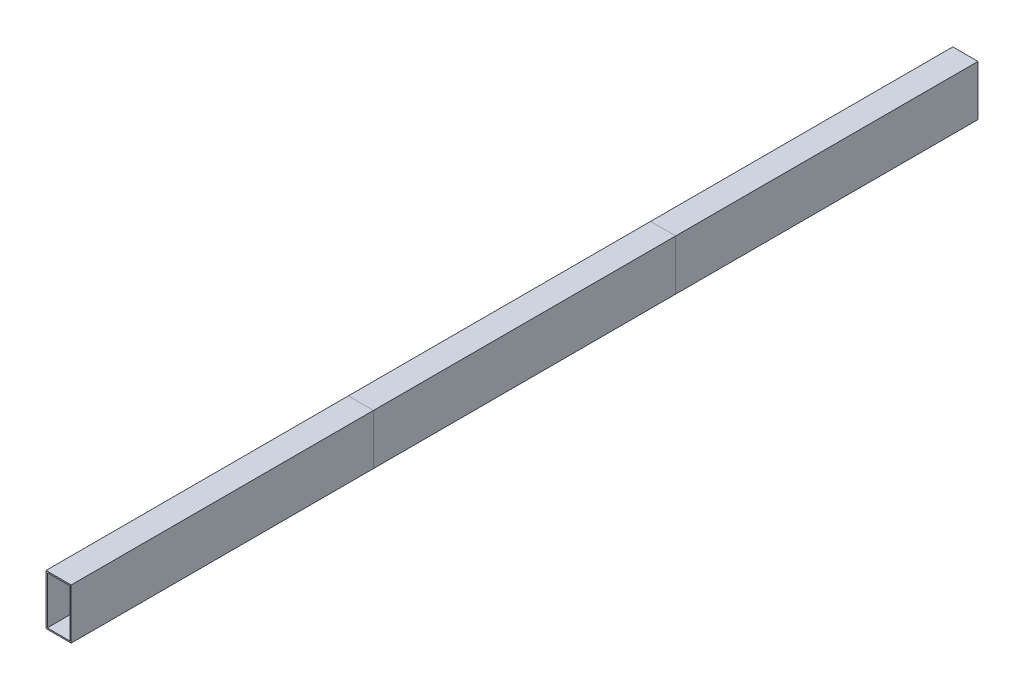
ISO-10303-21;
HEADER;
FILE_DESCRIPTION(('STEP AP214'),'2;1');
FILE_NAME('part.step','',(''),(''),'','','');
FILE_SCHEMA(('AUTOMOTIVE_DESIGN { 1 0 10303 214 1 1 1 1 }'));
ENDSEC;
DATA;
#1=APPLICATION_CONTEXT('core data for automotive mechanical design processes');
#2=APPLICATION_PROTOCOL_DEFINITION('international standard','automotive_design',2000,#1);
#3=PRODUCT_CONTEXT('',#1,'mechanical');
#4=PRODUCT('Part','Part','',(#3));
#5=PRODUCT_RELATED_PRODUCT_CATEGORY('part','',(#4));
#6=PRODUCT_DEFINITION_FORMATION('','',#4);
#7=PRODUCT_DEFINITION_CONTEXT('part definition',#1,'design');
#8=PRODUCT_DEFINITION('design','',#6,#7);
#9=PRODUCT_DEFINITION_SHAPE('','',#8);
#10=(LENGTH_UNIT() NAMED_UNIT(*) SI_UNIT(.MILLI.,.METRE.));
#11=(NAMED_UNIT(*) PLANE_ANGLE_UNIT() SI_UNIT($,.RADIAN.));
#12=(NAMED_UNIT(*) SI_UNIT($,.STERADIAN.) SOLID_ANGLE_UNIT());
#13=UNCERTAINTY_MEASURE_WITH_UNIT(LENGTH_MEASURE(1.E-05),#10,'distance_accuracy_value','');
#14=(GEOMETRIC_REPRESENTATION_CONTEXT(3) GLOBAL_UNCERTAINTY_ASSIGNED_CONTEXT((#13)) GLOBAL_UNIT_ASSIGNED_CONTEXT((#10,
#11,#12)) REPRESENTATION_CONTEXT('',''));
#15=CARTESIAN_POINT('',(0.,0.,0.));
#16=DIRECTION('',(0.,0.,1.));
#17=DIRECTION('',(1.,0.,0.));
#18=AXIS2_PLACEMENT_3D('',#15,#16,#17);
#19=CARTESIAN_POINT('',(-50.,0.,3600.));
#20=DIRECTION('',(-1.,0.,0.));
#21=DIRECTION('',(0.,0.,1.));
#22=AXIS2_PLACEMENT_3D('',#19,#20,#21);
#23=PLANE('',#22);
#24=DIRECTION('',(0.,1.,0.));
#25=VECTOR('',#24,1.);
#26=CARTESIAN_POINT('',(-50.,0.,2400.));
#27=LINE('',#26,#25);
#28=CARTESIAN_POINT('',(-50.,-100.,2400.));
#29=VERTEX_POINT('',#28);
#30=CARTESIAN_POINT('',(-50.,100.,2400.));
#31=VERTEX_POINT('',#30);
#32=EDGE_CURVE('E148',#29,#31,#27,.T.);
#33=ORIENTED_EDGE('',*,*,#32,.F.);
#34=DIRECTION('',(0.,0.,-1.));
#35=VECTOR('',#34,1.);
#36=CARTESIAN_POINT('',(-50.,-100.,3600.));
#37=LINE('',#36,#35);
#38=CARTESIAN_POINT('',(-50.,-100.,3600.));
#39=VERTEX_POINT('',#38);
#40=EDGE_CURVE('E13',#39,#29,#37,.T.);
#41=ORIENTED_EDGE('',*,*,#40,.F.);
#42=DIRECTION('',(0.,1.,0.));
#43=VECTOR('',#42,1.);
#44=CARTESIAN_POINT('',(-50.,0.,3600.));
#45=LINE('',#44,#43);
#46=CARTESIAN_POINT('',(-50.,100.,3600.));
#47=VERTEX_POINT('',#46);
#48=EDGE_CURVE('E152',#39,#47,#45,.T.);
#49=ORIENTED_EDGE('',*,*,#48,.T.);
#50=DIRECTION('',(0.,0.,-1.));
#51=VECTOR('',#50,1.);
#52=CARTESIAN_POINT('',(-50.,100.,3600.));
#53=LINE('',#52,#51);
#54=EDGE_CURVE('E54',#47,#31,#53,.T.);
#55=ORIENTED_EDGE('',*,*,#54,.T.);
#56=EDGE_LOOP('',(#33,#41,#49,#55));
#57=FACE_BOUND('',#56,.T.);
#58=ADVANCED_FACE('F51',(#57),#23,.T.);
#59=CARTESIAN_POINT('',(0.,-100.,3600.));
#60=DIRECTION('',(0.,-1.,0.));
#61=DIRECTION('',(0.,0.,-1.));
#62=AXIS2_PLACEMENT_3D('',#59,#60,#61);
#63=PLANE('',#62);
#64=DIRECTION('',(-1.,0.,0.));
#65=VECTOR('',#64,1.);
#66=CARTESIAN_POINT('',(0.,-100.,2400.));
#67=LINE('',#66,#65);
#68=CARTESIAN_POINT('',(50.,-100.,2400.));
#69=VERTEX_POINT('',#68);
#70=EDGE_CURVE('E156',#69,#29,#67,.T.);
#71=ORIENTED_EDGE('',*,*,#70,.F.);
#72=DIRECTION('',(0.,0.,-1.));
#73=VECTOR('',#72,1.);
#74=CARTESIAN_POINT('',(50.,-100.,3600.));
#75=LINE('',#74,#73);
#76=CARTESIAN_POINT('',(50.,-100.,3600.));
#77=VERTEX_POINT('',#76);
#78=EDGE_CURVE('E59',#77,#69,#75,.T.);
#79=ORIENTED_EDGE('',*,*,#78,.F.);
#80=DIRECTION('',(-1.,0.,0.));
#81=VECTOR('',#80,1.);
#82=CARTESIAN_POINT('',(0.,-100.,3600.));
#83=LINE('',#82,#81);
#84=EDGE_CURVE('E162',#77,#39,#83,.T.);
#85=ORIENTED_EDGE('',*,*,#84,.T.);
#86=ORIENTED_EDGE('',*,*,#40,.T.);
#87=EDGE_LOOP('',(#71,#79,#85,#86));
#88=FACE_BOUND('',#87,.T.);
#89=ADVANCED_FACE('F189',(#88),#63,.T.);
#90=CARTESIAN_POINT('',(50.,0.,3600.));
#91=DIRECTION('',(1.,0.,0.));
#92=DIRECTION('',(0.,0.,-1.));
#93=AXIS2_PLACEMENT_3D('',#90,#91,#92);
#94=PLANE('',#93);
#95=DIRECTION('',(0.,-1.,0.));
#96=VECTOR('',#95,1.);
#97=CARTESIAN_POINT('',(50.,0.,2400.));
#98=LINE('',#97,#96);
#99=CARTESIAN_POINT('',(50.,100.,2400.));
#100=VERTEX_POINT('',#99);
#101=EDGE_CURVE('E170',#100,#69,#98,.T.);
#102=ORIENTED_EDGE('',*,*,#101,.F.);
#103=DIRECTION('',(0.,0.,-1.));
#104=VECTOR('',#103,1.);
#105=CARTESIAN_POINT('',(50.,100.,3600.));
#106=LINE('',#105,#104);
#107=CARTESIAN_POINT('',(50.,100.,3600.));
#108=VERTEX_POINT('',#107);
#109=EDGE_CURVE('E176',#108,#100,#106,.T.);
#110=ORIENTED_EDGE('',*,*,#109,.F.);
#111=DIRECTION('',(0.,-1.,0.));
#112=VECTOR('',#111,1.);
#113=CARTESIAN_POINT('',(50.,0.,3600.));
#114=LINE('',#113,#112);
#115=EDGE_CURVE('E159',#108,#77,#114,.T.);
#116=ORIENTED_EDGE('',*,*,#115,.T.);
#117=ORIENTED_EDGE('',*,*,#78,.T.);
#118=EDGE_LOOP('',(#102,#110,#116,#117));
#119=FACE_BOUND('',#118,.T.);
#120=ADVANCED_FACE('F193',(#119),#94,.T.);
#121=CARTESIAN_POINT('',(0.,100.,3600.));
#122=DIRECTION('',(0.,1.,0.));
#123=DIRECTION('',(0.,0.,1.));
#124=AXIS2_PLACEMENT_3D('',#121,#122,#123);
#125=PLANE('',#124);
#126=DIRECTION('',(1.,0.,0.));
#127=VECTOR('',#126,1.);
#128=CARTESIAN_POINT('',(0.,100.,2400.));
#129=LINE('',#128,#127);
#130=EDGE_CURVE('E167',#31,#100,#129,.T.);
#131=ORIENTED_EDGE('',*,*,#130,.F.);
#132=ORIENTED_EDGE('',*,*,#54,.F.);
#133=DIRECTION('',(1.,0.,0.));
#134=VECTOR('',#133,1.);
#135=CARTESIAN_POINT('',(0.,100.,3600.));
#136=LINE('',#135,#134);
#137=EDGE_CURVE('E155',#47,#108,#136,.T.);
#138=ORIENTED_EDGE('',*,*,#137,.T.);
#139=ORIENTED_EDGE('',*,*,#109,.T.);
#140=EDGE_LOOP('',(#131,#132,#138,#139));
#141=FACE_BOUND('',#140,.T.);
#142=ADVANCED_FACE('F184',(#141),#125,.T.);
#143=CARTESIAN_POINT('',(0.,0.,3600.));
#144=DIRECTION('',(0.,0.,-1.));
#145=DIRECTION('',(-1.,0.,0.));
#146=AXIS2_PLACEMENT_3D('',#143,#144,#145);
#147=PLANE('',#146);
#148=DIRECTION('',(-1.,0.,0.));
#149=VECTOR('',#148,1.);
#150=CARTESIAN_POINT('',(0.,-95.,3600.));
#151=LINE('',#150,#149);
#152=CARTESIAN_POINT('',(45.,-95.,3600.));
#153=VERTEX_POINT('',#152);
#154=CARTESIAN_POINT('',(-45.,-95.,3600.));
#155=VERTEX_POINT('',#154);
#156=EDGE_CURVE('E123',#153,#155,#151,.T.);
#157=ORIENTED_EDGE('',*,*,#156,.T.);
#158=DIRECTION('',(0.,1.,0.));
#159=VECTOR('',#158,1.);
#160=CARTESIAN_POINT('',(-45.,0.,3600.));
#161=LINE('',#160,#159);
#162=CARTESIAN_POINT('',(-45.,95.,3600.));
#163=VERTEX_POINT('',#162);
#164=EDGE_CURVE('E117',#155,#163,#161,.T.);
#165=ORIENTED_EDGE('',*,*,#164,.T.);
#166=DIRECTION('',(1.,0.,0.));
#167=VECTOR('',#166,1.);
#168=CARTESIAN_POINT('',(0.,95.,3600.));
#169=LINE('',#168,#167);
#170=CARTESIAN_POINT('',(45.,95.,3600.));
#171=VERTEX_POINT('',#170);
#172=EDGE_CURVE('E126',#163,#171,#169,.T.);
#173=ORIENTED_EDGE('',*,*,#172,.T.);
#174=DIRECTION('',(0.,-1.,0.));
#175=VECTOR('',#174,1.);
#176=CARTESIAN_POINT('',(45.,0.,3600.));
#177=LINE('',#176,#175);
#178=EDGE_CURVE('E66',#171,#153,#177,.T.);
#179=ORIENTED_EDGE('',*,*,#178,.T.);
#180=EDGE_LOOP('',(#157,#165,#173,#179));
#181=FACE_BOUND('',#180,.T.);
#182=ORIENTED_EDGE('',*,*,#48,.F.);
#183=ORIENTED_EDGE('',*,*,#84,.F.);
#184=ORIENTED_EDGE('',*,*,#115,.F.);
#185=ORIENTED_EDGE('',*,*,#137,.F.);
#186=EDGE_LOOP('',(#182,#183,#184,#185));
#187=FACE_BOUND('',#186,.T.);
#188=ADVANCED_FACE('F130',(#181,#187),#147,.F.);
#189=CARTESIAN_POINT('',(0.,0.,2400.));
#190=DIRECTION('',(0.,0.,-1.));
#191=DIRECTION('',(-1.,0.,0.));
#192=AXIS2_PLACEMENT_3D('',#189,#190,#191);
#193=PLANE('',#192);
#194=DIRECTION('',(0.,1.,0.));
#195=VECTOR('',#194,1.);
#196=CARTESIAN_POINT('',(-45.,0.,2400.));
#197=LINE('',#196,#195);
#198=CARTESIAN_POINT('',(-45.,-95.,2400.));
#199=VERTEX_POINT('',#198);
#200=CARTESIAN_POINT('',(-45.,95.,2400.));
#201=VERTEX_POINT('',#200);
#202=EDGE_CURVE('E74',#199,#201,#197,.T.);
#203=ORIENTED_EDGE('',*,*,#202,.F.);
#204=DIRECTION('',(-1.,0.,0.));
#205=VECTOR('',#204,1.);
#206=CARTESIAN_POINT('',(0.,-95.,2400.));
#207=LINE('',#206,#205);
#208=CARTESIAN_POINT('',(45.,-95.,2400.));
#209=VERTEX_POINT('',#208);
#210=EDGE_CURVE('E133',#209,#199,#207,.T.);
#211=ORIENTED_EDGE('',*,*,#210,.F.);
#212=DIRECTION('',(0.,-1.,0.));
#213=VECTOR('',#212,1.);
#214=CARTESIAN_POINT('',(45.,0.,2400.));
#215=LINE('',#214,#213);
#216=CARTESIAN_POINT('',(45.,95.,2400.));
#217=VERTEX_POINT('',#216);
#218=EDGE_CURVE('E136',#217,#209,#215,.T.);
#219=ORIENTED_EDGE('',*,*,#218,.F.);
#220=DIRECTION('',(1.,0.,0.));
#221=VECTOR('',#220,1.);
#222=CARTESIAN_POINT('',(0.,95.,2400.));
#223=LINE('',#222,#221);
#224=EDGE_CURVE('E142',#201,#217,#223,.T.);
#225=ORIENTED_EDGE('',*,*,#224,.F.);
#226=EDGE_LOOP('',(#203,#211,#219,#225));
#227=FACE_BOUND('',#226,.T.);
#228=ORIENTED_EDGE('',*,*,#32,.T.);
#229=ORIENTED_EDGE('',*,*,#130,.T.);
#230=ORIENTED_EDGE('',*,*,#101,.T.);
#231=ORIENTED_EDGE('',*,*,#70,.T.);
#232=EDGE_LOOP('',(#228,#229,#230,#231));
#233=FACE_BOUND('',#232,.T.);
#234=ADVANCED_FACE('F186',(#227,#233),#193,.T.);
#235=CARTESIAN_POINT('',(-45.,0.,3600.));
#236=DIRECTION('',(-1.,0.,0.));
#237=DIRECTION('',(0.,0.,1.));
#238=AXIS2_PLACEMENT_3D('',#235,#236,#237);
#239=PLANE('',#238);
#240=ORIENTED_EDGE('',*,*,#202,.T.);
#241=DIRECTION('',(0.,0.,-1.));
#242=VECTOR('',#241,1.);
#243=CARTESIAN_POINT('',(-45.,95.,3600.));
#244=LINE('',#243,#242);
#245=EDGE_CURVE('E113',#163,#201,#244,.T.);
#246=ORIENTED_EDGE('',*,*,#245,.F.);
#247=ORIENTED_EDGE('',*,*,#164,.F.);
#248=DIRECTION('',(0.,0.,-1.));
#249=VECTOR('',#248,1.);
#250=CARTESIAN_POINT('',(-45.,-95.,3600.));
#251=LINE('',#250,#249);
#252=EDGE_CURVE('E146',#155,#199,#251,.T.);
#253=ORIENTED_EDGE('',*,*,#252,.T.);
#254=EDGE_LOOP('',(#240,#246,#247,#253));
#255=FACE_BOUND('',#254,.T.);
#256=ADVANCED_FACE('F115',(#255),#239,.F.);
#257=CARTESIAN_POINT('',(0.,-95.,3600.));
#258=DIRECTION('',(0.,-1.,0.));
#259=DIRECTION('',(0.,0.,-1.));
#260=AXIS2_PLACEMENT_3D('',#257,#258,#259);
#261=PLANE('',#260);
#262=ORIENTED_EDGE('',*,*,#210,.T.);
#263=ORIENTED_EDGE('',*,*,#252,.F.);
#264=ORIENTED_EDGE('',*,*,#156,.F.);
#265=DIRECTION('',(0.,0.,-1.));
#266=VECTOR('',#265,1.);
#267=CARTESIAN_POINT('',(45.,-95.,3600.));
#268=LINE('',#267,#266);
#269=EDGE_CURVE('E149',#153,#209,#268,.T.);
#270=ORIENTED_EDGE('',*,*,#269,.T.);
#271=EDGE_LOOP('',(#262,#263,#264,#270));
#272=FACE_BOUND('',#271,.T.);
#273=ADVANCED_FACE('F244',(#272),#261,.F.);
#274=CARTESIAN_POINT('',(45.,0.,3600.));
#275=DIRECTION('',(1.,0.,0.));
#276=DIRECTION('',(0.,0.,-1.));
#277=AXIS2_PLACEMENT_3D('',#274,#275,#276);
#278=PLANE('',#277);
#279=ORIENTED_EDGE('',*,*,#218,.T.);
#280=ORIENTED_EDGE('',*,*,#269,.F.);
#281=ORIENTED_EDGE('',*,*,#178,.F.);
#282=DIRECTION('',(0.,0.,-1.));
#283=VECTOR('',#282,1.);
#284=CARTESIAN_POINT('',(45.,95.,3600.));
#285=LINE('',#284,#283);
#286=EDGE_CURVE('E122',#171,#217,#285,.T.);
#287=ORIENTED_EDGE('',*,*,#286,.T.);
#288=EDGE_LOOP('',(#279,#280,#281,#287));
#289=FACE_BOUND('',#288,.T.);
#290=ADVANCED_FACE('F253',(#289),#278,.F.);
#291=CARTESIAN_POINT('',(0.,95.,3600.));
#292=DIRECTION('',(0.,1.,0.));
#293=DIRECTION('',(0.,0.,1.));
#294=AXIS2_PLACEMENT_3D('',#291,#292,#293);
#295=PLANE('',#294);
#296=ORIENTED_EDGE('',*,*,#224,.T.);
#297=ORIENTED_EDGE('',*,*,#286,.F.);
#298=ORIENTED_EDGE('',*,*,#172,.F.);
#299=ORIENTED_EDGE('',*,*,#245,.T.);
#300=EDGE_LOOP('',(#296,#297,#298,#299));
#301=FACE_BOUND('',#300,.T.);
#302=ADVANCED_FACE('F127',(#301),#295,.F.);
#303=CLOSED_SHELL('',(#58,#89,#120,#142,#188,#234,#256,#273,#290,#302));
#304=MANIFOLD_SOLID_BREP('B2',#303);
#305=CARTESIAN_POINT('',(0.,0.,2400.));
#306=DIRECTION('',(0.,0.,1.));
#307=DIRECTION('',(1.,0.,0.));
#308=AXIS2_PLACEMENT_3D('',#305,#306,#307);
#309=PLANE('',#308);
#310=DIRECTION('',(0.,1.,0.));
#311=VECTOR('',#310,1.);
#312=CARTESIAN_POINT('',(50.,0.,2400.));
#313=LINE('',#312,#311);
#314=CARTESIAN_POINT('',(50.,-100.,2400.));
#315=VERTEX_POINT('',#314);
#316=CARTESIAN_POINT('',(50.,100.,2400.));
#317=VERTEX_POINT('',#316);
#318=EDGE_CURVE('E390',#315,#317,#313,.T.);
#319=ORIENTED_EDGE('',*,*,#318,.T.);
#320=DIRECTION('',(-1.,0.,0.));
#321=VECTOR('',#320,1.);
#322=CARTESIAN_POINT('',(0.,100.,2400.));
#323=LINE('',#322,#321);
#324=CARTESIAN_POINT('',(-50.,100.,2400.));
#325=VERTEX_POINT('',#324);
#326=EDGE_CURVE('E393',#317,#325,#323,.T.);
#327=ORIENTED_EDGE('',*,*,#326,.T.);
#328=DIRECTION('',(0.,-1.,0.));
#329=VECTOR('',#328,1.);
#330=CARTESIAN_POINT('',(-50.,0.,2400.));
#331=LINE('',#330,#329);
#332=CARTESIAN_POINT('',(-50.,-100.,2400.));
#333=VERTEX_POINT('',#332);
#334=EDGE_CURVE('E396',#325,#333,#331,.T.);
#335=ORIENTED_EDGE('',*,*,#334,.T.);
#336=DIRECTION('',(1.,0.,0.));
#337=VECTOR('',#336,1.);
#338=CARTESIAN_POINT('',(0.,-100.,2400.));
#339=LINE('',#338,#337);
#340=EDGE_CURVE('E398',#333,#315,#339,.T.);
#341=ORIENTED_EDGE('',*,*,#340,.T.);
#342=EDGE_LOOP('',(#319,#327,#335,#341));
#343=FACE_BOUND('',#342,.T.);
#344=DIRECTION('',(-1.,0.,0.));
#345=VECTOR('',#344,1.);
#346=CARTESIAN_POINT('',(0.,95.,2400.));
#347=LINE('',#346,#345);
#348=CARTESIAN_POINT('',(45.,95.,2400.));
#349=VERTEX_POINT('',#348);
#350=CARTESIAN_POINT('',(-45.,95.,2400.));
#351=VERTEX_POINT('',#350);
#352=EDGE_CURVE('E362',#349,#351,#347,.T.);
#353=ORIENTED_EDGE('',*,*,#352,.F.);
#354=DIRECTION('',(0.,1.,0.));
#355=VECTOR('',#354,1.);
#356=CARTESIAN_POINT('',(45.,0.,2400.));
#357=LINE('',#356,#355);
#358=CARTESIAN_POINT('',(45.,-95.,2400.));
#359=VERTEX_POINT('',#358);
#360=EDGE_CURVE('E354',#359,#349,#357,.T.);
#361=ORIENTED_EDGE('',*,*,#360,.F.);
#362=DIRECTION('',(1.,0.,0.));
#363=VECTOR('',#362,1.);
#364=CARTESIAN_POINT('',(0.,-95.,2400.));
#365=LINE('',#364,#363);
#366=CARTESIAN_POINT('',(-45.,-95.,2400.));
#367=VERTEX_POINT('',#366);
#368=EDGE_CURVE('E376',#367,#359,#365,.T.);
#369=ORIENTED_EDGE('',*,*,#368,.F.);
#370=DIRECTION('',(0.,-1.,0.));
#371=VECTOR('',#370,1.);
#372=CARTESIAN_POINT('',(-45.,0.,2400.));
#373=LINE('',#372,#371);
#374=EDGE_CURVE('E374',#351,#367,#373,.T.);
#375=ORIENTED_EDGE('',*,*,#374,.F.);
#376=EDGE_LOOP('',(#353,#361,#369,#375));
#377=FACE_BOUND('',#376,.T.);
#378=ADVANCED_FACE('F289',(#343,#377),#309,.T.);
#379=CARTESIAN_POINT('',(0.,0.,1200.));
#380=DIRECTION('',(0.,0.,1.));
#381=DIRECTION('',(1.,0.,0.));
#382=AXIS2_PLACEMENT_3D('',#379,#380,#381);
#383=PLANE('',#382);
#384=DIRECTION('',(0.,1.,0.));
#385=VECTOR('',#384,1.);
#386=CARTESIAN_POINT('',(50.,0.,1200.));
#387=LINE('',#386,#385);
#388=CARTESIAN_POINT('',(50.,-100.,1200.));
#389=VERTEX_POINT('',#388);
#390=CARTESIAN_POINT('',(50.,100.,1200.));
#391=VERTEX_POINT('',#390);
#392=EDGE_CURVE('E370',#389,#391,#387,.T.);
#393=ORIENTED_EDGE('',*,*,#392,.F.);
#394=DIRECTION('',(1.,0.,0.));
#395=VECTOR('',#394,1.);
#396=CARTESIAN_POINT('',(0.,-100.,1200.));
#397=LINE('',#396,#395);
#398=CARTESIAN_POINT('',(-50.,-100.,1200.));
#399=VERTEX_POINT('',#398);
#400=EDGE_CURVE('E394',#399,#389,#397,.T.);
#401=ORIENTED_EDGE('',*,*,#400,.F.);
#402=DIRECTION('',(0.,-1.,0.));
#403=VECTOR('',#402,1.);
#404=CARTESIAN_POINT('',(-50.,0.,1200.));
#405=LINE('',#404,#403);
#406=CARTESIAN_POINT('',(-50.,100.,1200.));
#407=VERTEX_POINT('',#406);
#408=EDGE_CURVE('E405',#407,#399,#405,.T.);
#409=ORIENTED_EDGE('',*,*,#408,.F.);
#410=DIRECTION('',(-1.,0.,0.));
#411=VECTOR('',#410,1.);
#412=CARTESIAN_POINT('',(0.,100.,1200.));
#413=LINE('',#412,#411);
#414=EDGE_CURVE('E403',#391,#407,#413,.T.);
#415=ORIENTED_EDGE('',*,*,#414,.F.);
#416=EDGE_LOOP('',(#393,#401,#409,#415));
#417=FACE_BOUND('',#416,.T.);
#418=DIRECTION('',(0.,1.,0.));
#419=VECTOR('',#418,1.);
#420=CARTESIAN_POINT('',(45.,0.,1200.));
#421=LINE('',#420,#419);
#422=CARTESIAN_POINT('',(45.,-95.,1200.));
#423=VERTEX_POINT('',#422);
#424=CARTESIAN_POINT('',(45.,95.,1200.));
#425=VERTEX_POINT('',#424);
#426=EDGE_CURVE('E312',#423,#425,#421,.T.);
#427=ORIENTED_EDGE('',*,*,#426,.T.);
#428=DIRECTION('',(-1.,0.,0.));
#429=VECTOR('',#428,1.);
#430=CARTESIAN_POINT('',(0.,95.,1200.));
#431=LINE('',#430,#429);
#432=CARTESIAN_POINT('',(-45.,95.,1200.));
#433=VERTEX_POINT('',#432);
#434=EDGE_CURVE('E369',#425,#433,#431,.T.);
#435=ORIENTED_EDGE('',*,*,#434,.T.);
#436=DIRECTION('',(0.,-1.,0.));
#437=VECTOR('',#436,1.);
#438=CARTESIAN_POINT('',(-45.,0.,1200.));
#439=LINE('',#438,#437);
#440=CARTESIAN_POINT('',(-45.,-95.,1200.));
#441=VERTEX_POINT('',#440);
#442=EDGE_CURVE('E382',#433,#441,#439,.T.);
#443=ORIENTED_EDGE('',*,*,#442,.T.);
#444=DIRECTION('',(1.,0.,0.));
#445=VECTOR('',#444,1.);
#446=CARTESIAN_POINT('',(0.,-95.,1200.));
#447=LINE('',#446,#445);
#448=EDGE_CURVE('E363',#441,#423,#447,.T.);
#449=ORIENTED_EDGE('',*,*,#448,.T.);
#450=EDGE_LOOP('',(#427,#435,#443,#449));
#451=FACE_BOUND('',#450,.T.);
#452=ADVANCED_FACE('F423',(#417,#451),#383,.F.);
#453=CARTESIAN_POINT('',(50.,0.,2400.));
#454=DIRECTION('',(-1.,0.,0.));
#455=DIRECTION('',(0.,0.,1.));
#456=AXIS2_PLACEMENT_3D('',#453,#454,#455);
#457=PLANE('',#456);
#458=ORIENTED_EDGE('',*,*,#392,.T.);
#459=DIRECTION('',(0.,0.,-1.));
#460=VECTOR('',#459,1.);
#461=CARTESIAN_POINT('',(50.,100.,2400.));
#462=LINE('',#461,#460);
#463=EDGE_CURVE('E49',#317,#391,#462,.T.);
#464=ORIENTED_EDGE('',*,*,#463,.F.);
#465=ORIENTED_EDGE('',*,*,#318,.F.);
#466=DIRECTION('',(0.,0.,-1.));
#467=VECTOR('',#466,1.);
#468=CARTESIAN_POINT('',(50.,-100.,2400.));
#469=LINE('',#468,#467);
#470=EDGE_CURVE('E400',#315,#389,#469,.T.);
#471=ORIENTED_EDGE('',*,*,#470,.T.);
#472=EDGE_LOOP('',(#458,#464,#465,#471));
#473=FACE_BOUND('',#472,.T.);
#474=ADVANCED_FACE('F291',(#473),#457,.F.);
#475=CARTESIAN_POINT('',(0.,100.,2400.));
#476=DIRECTION('',(0.,-1.,0.));
#477=DIRECTION('',(0.,0.,-1.));
#478=AXIS2_PLACEMENT_3D('',#475,#476,#477);
#479=PLANE('',#478);
#480=ORIENTED_EDGE('',*,*,#414,.T.);
#481=DIRECTION('',(0.,0.,-1.));
#482=VECTOR('',#481,1.);
#483=CARTESIAN_POINT('',(-50.,100.,2400.));
#484=LINE('',#483,#482);
#485=EDGE_CURVE('E297',#325,#407,#484,.T.);
#486=ORIENTED_EDGE('',*,*,#485,.F.);
#487=ORIENTED_EDGE('',*,*,#326,.F.);
#488=ORIENTED_EDGE('',*,*,#463,.T.);
#489=EDGE_LOOP('',(#480,#486,#487,#488));
#490=FACE_BOUND('',#489,.T.);
#491=ADVANCED_FACE('F433',(#490),#479,.F.);
#492=CARTESIAN_POINT('',(-50.,0.,2400.));
#493=DIRECTION('',(1.,0.,0.));
#494=DIRECTION('',(0.,0.,-1.));
#495=AXIS2_PLACEMENT_3D('',#492,#493,#494);
#496=PLANE('',#495);
#497=ORIENTED_EDGE('',*,*,#408,.T.);
#498=DIRECTION('',(0.,0.,-1.));
#499=VECTOR('',#498,1.);
#500=CARTESIAN_POINT('',(-50.,-100.,2400.));
#501=LINE('',#500,#499);
#502=EDGE_CURVE('E410',#333,#399,#501,.T.);
#503=ORIENTED_EDGE('',*,*,#502,.F.);
#504=ORIENTED_EDGE('',*,*,#334,.F.);
#505=ORIENTED_EDGE('',*,*,#485,.T.);
#506=EDGE_LOOP('',(#497,#503,#504,#505));
#507=FACE_BOUND('',#506,.T.);
#508=ADVANCED_FACE('F417',(#507),#496,.F.);
#509=CARTESIAN_POINT('',(0.,-100.,2400.));
#510=DIRECTION('',(0.,1.,0.));
#511=DIRECTION('',(0.,0.,1.));
#512=AXIS2_PLACEMENT_3D('',#509,#510,#511);
#513=PLANE('',#512);
#514=ORIENTED_EDGE('',*,*,#400,.T.);
#515=ORIENTED_EDGE('',*,*,#470,.F.);
#516=ORIENTED_EDGE('',*,*,#340,.F.);
#517=ORIENTED_EDGE('',*,*,#502,.T.);
#518=EDGE_LOOP('',(#514,#515,#516,#517));
#519=FACE_BOUND('',#518,.T.);
#520=ADVANCED_FACE('F427',(#519),#513,.F.);
#521=CARTESIAN_POINT('',(45.,0.,2400.));
#522=DIRECTION('',(-1.,0.,0.));
#523=DIRECTION('',(0.,0.,1.));
#524=AXIS2_PLACEMENT_3D('',#521,#522,#523);
#525=PLANE('',#524);
#526=ORIENTED_EDGE('',*,*,#426,.F.);
#527=DIRECTION('',(0.,0.,-1.));
#528=VECTOR('',#527,1.);
#529=CARTESIAN_POINT('',(45.,-95.,2400.));
#530=LINE('',#529,#528);
#531=EDGE_CURVE('E358',#359,#423,#530,.T.);
#532=ORIENTED_EDGE('',*,*,#531,.F.);
#533=ORIENTED_EDGE('',*,*,#360,.T.);
#534=DIRECTION('',(0.,0.,-1.));
#535=VECTOR('',#534,1.);
#536=CARTESIAN_POINT('',(45.,95.,2400.));
#537=LINE('',#536,#535);
#538=EDGE_CURVE('E357',#349,#425,#537,.T.);
#539=ORIENTED_EDGE('',*,*,#538,.T.);
#540=EDGE_LOOP('',(#526,#532,#533,#539));
#541=FACE_BOUND('',#540,.T.);
#542=ADVANCED_FACE('F356',(#541),#525,.T.);
#543=CARTESIAN_POINT('',(0.,95.,2400.));
#544=DIRECTION('',(0.,-1.,0.));
#545=DIRECTION('',(0.,0.,-1.));
#546=AXIS2_PLACEMENT_3D('',#543,#544,#545);
#547=PLANE('',#546);
#548=ORIENTED_EDGE('',*,*,#434,.F.);
#549=ORIENTED_EDGE('',*,*,#538,.F.);
#550=ORIENTED_EDGE('',*,*,#352,.T.);
#551=DIRECTION('',(0.,0.,-1.));
#552=VECTOR('',#551,1.);
#553=CARTESIAN_POINT('',(-45.,95.,2400.));
#554=LINE('',#553,#552);
#555=EDGE_CURVE('E371',#351,#433,#554,.T.);
#556=ORIENTED_EDGE('',*,*,#555,.T.);
#557=EDGE_LOOP('',(#548,#549,#550,#556));
#558=FACE_BOUND('',#557,.T.);
#559=ADVANCED_FACE('F366',(#558),#547,.T.);
#560=CARTESIAN_POINT('',(-45.,0.,2400.));
#561=DIRECTION('',(1.,0.,0.));
#562=DIRECTION('',(0.,0.,-1.));
#563=AXIS2_PLACEMENT_3D('',#560,#561,#562);
#564=PLANE('',#563);
#565=ORIENTED_EDGE('',*,*,#442,.F.);
#566=ORIENTED_EDGE('',*,*,#555,.F.);
#567=ORIENTED_EDGE('',*,*,#374,.T.);
#568=DIRECTION('',(0.,0.,-1.));
#569=VECTOR('',#568,1.);
#570=CARTESIAN_POINT('',(-45.,-95.,2400.));
#571=LINE('',#570,#569);
#572=EDGE_CURVE('E304',#367,#441,#571,.T.);
#573=ORIENTED_EDGE('',*,*,#572,.T.);
#574=EDGE_LOOP('',(#565,#566,#567,#573));
#575=FACE_BOUND('',#574,.T.);
#576=ADVANCED_FACE('F456',(#575),#564,.T.);
#577=CARTESIAN_POINT('',(0.,-95.,2400.));
#578=DIRECTION('',(0.,1.,0.));
#579=DIRECTION('',(0.,0.,1.));
#580=AXIS2_PLACEMENT_3D('',#577,#578,#579);
#581=PLANE('',#580);
#582=ORIENTED_EDGE('',*,*,#448,.F.);
#583=ORIENTED_EDGE('',*,*,#572,.F.);
#584=ORIENTED_EDGE('',*,*,#368,.T.);
#585=ORIENTED_EDGE('',*,*,#531,.T.);
#586=EDGE_LOOP('',(#582,#583,#584,#585));
#587=FACE_BOUND('',#586,.T.);
#588=ADVANCED_FACE('F460',(#587),#581,.T.);
#589=CLOSED_SHELL('',(#378,#452,#474,#491,#508,#520,#542,#559,#576,#588));
#590=MANIFOLD_SOLID_BREP('B7',#589);
#591=CARTESIAN_POINT('',(0.,0.,1200.));
#592=DIRECTION('',(0.,0.,-1.));
#593=DIRECTION('',(-1.,0.,0.));
#594=AXIS2_PLACEMENT_3D('',#591,#592,#593);
#595=PLANE('',#594);
#596=DIRECTION('',(0.,1.,0.));
#597=VECTOR('',#596,1.);
#598=CARTESIAN_POINT('',(50.,-100.,1200.));
#599=LINE('',#598,#597);
#600=CARTESIAN_POINT('',(50.,-100.,1200.));
#601=VERTEX_POINT('',#600);
#602=CARTESIAN_POINT('',(50.,100.,1200.));
#603=VERTEX_POINT('',#602);
#604=EDGE_CURVE('E619',#601,#603,#599,.T.);
#605=ORIENTED_EDGE('',*,*,#604,.T.);
#606=DIRECTION('',(-1.,0.,0.));
#607=VECTOR('',#606,1.);
#608=CARTESIAN_POINT('',(-50.,100.,1200.));
#609=LINE('',#608,#607);
#610=CARTESIAN_POINT('',(-50.,100.,1200.));
#611=VERTEX_POINT('',#610);
#612=EDGE_CURVE('E622',#603,#611,#609,.T.);
#613=ORIENTED_EDGE('',*,*,#612,.T.);
#614=DIRECTION('',(0.,-1.,0.));
#615=VECTOR('',#614,1.);
#616=CARTESIAN_POINT('',(-50.,-100.,1200.));
#617=LINE('',#616,#615);
#618=CARTESIAN_POINT('',(-50.,-100.,1200.));
#619=VERTEX_POINT('',#618);
#620=EDGE_CURVE('E625',#611,#619,#617,.T.);
#621=ORIENTED_EDGE('',*,*,#620,.T.);
#622=DIRECTION('',(1.,0.,0.));
#623=VECTOR('',#622,1.);
#624=CARTESIAN_POINT('',(-50.,-100.,1200.));
#625=LINE('',#624,#623);
#626=EDGE_CURVE('E627',#619,#601,#625,.T.);
#627=ORIENTED_EDGE('',*,*,#626,.T.);
#628=EDGE_LOOP('',(#605,#613,#621,#627));
#629=FACE_BOUND('',#628,.T.);
#630=DIRECTION('',(0.,1.,0.));
#631=VECTOR('',#630,1.);
#632=CARTESIAN_POINT('',(45.,-95.,1200.));
#633=LINE('',#632,#631);
#634=CARTESIAN_POINT('',(45.,-95.,1200.));
#635=VERTEX_POINT('',#634);
#636=CARTESIAN_POINT('',(45.,95.,1200.));
#637=VERTEX_POINT('',#636);
#638=EDGE_CURVE('E583',#635,#637,#633,.T.);
#639=ORIENTED_EDGE('',*,*,#638,.F.);
#640=DIRECTION('',(1.,0.,0.));
#641=VECTOR('',#640,1.);
#642=CARTESIAN_POINT('',(-45.,-95.,1200.));
#643=LINE('',#642,#641);
#644=CARTESIAN_POINT('',(-45.,-95.,1200.));
#645=VERTEX_POINT('',#644);
#646=EDGE_CURVE('E605',#645,#635,#643,.T.);
#647=ORIENTED_EDGE('',*,*,#646,.F.);
#648=DIRECTION('',(0.,-1.,0.));
#649=VECTOR('',#648,1.);
#650=CARTESIAN_POINT('',(-45.,-95.,1200.));
#651=LINE('',#650,#649);
#652=CARTESIAN_POINT('',(-45.,95.,1200.));
#653=VERTEX_POINT('',#652);
#654=EDGE_CURVE('E603',#653,#645,#651,.T.);
#655=ORIENTED_EDGE('',*,*,#654,.F.);
#656=DIRECTION('',(-1.,0.,0.));
#657=VECTOR('',#656,1.);
#658=CARTESIAN_POINT('',(-45.,95.,1200.));
#659=LINE('',#658,#657);
#660=EDGE_CURVE('E591',#637,#653,#659,.T.);
#661=ORIENTED_EDGE('',*,*,#660,.F.);
#662=EDGE_LOOP('',(#639,#647,#655,#661));
#663=FACE_BOUND('',#662,.T.);
#664=ADVANCED_FACE('F518',(#629,#663),#595,.F.);
#665=CARTESIAN_POINT('',(0.,0.,0.));
#666=DIRECTION('',(0.,0.,-1.));
#667=DIRECTION('',(-1.,0.,0.));
#668=AXIS2_PLACEMENT_3D('',#665,#666,#667);
#669=PLANE('',#668);
#670=DIRECTION('',(0.,1.,0.));
#671=VECTOR('',#670,1.);
#672=CARTESIAN_POINT('',(50.,-100.,0.));
#673=LINE('',#672,#671);
#674=CARTESIAN_POINT('',(50.,-100.,0.));
#675=VERTEX_POINT('',#674);
#676=CARTESIAN_POINT('',(50.,100.,0.));
#677=VERTEX_POINT('',#676);
#678=EDGE_CURVE('E599',#675,#677,#673,.T.);
#679=ORIENTED_EDGE('',*,*,#678,.F.);
#680=DIRECTION('',(1.,0.,0.));
#681=VECTOR('',#680,1.);
#682=CARTESIAN_POINT('',(-50.,-100.,0.));
#683=LINE('',#682,#681);
#684=CARTESIAN_POINT('',(-50.,-100.,0.));
#685=VERTEX_POINT('',#684);
#686=EDGE_CURVE('E623',#685,#675,#683,.T.);
#687=ORIENTED_EDGE('',*,*,#686,.F.);
#688=DIRECTION('',(0.,-1.,0.));
#689=VECTOR('',#688,1.);
#690=CARTESIAN_POINT('',(-50.,-100.,0.));
#691=LINE('',#690,#689);
#692=CARTESIAN_POINT('',(-50.,100.,0.));
#693=VERTEX_POINT('',#692);
#694=EDGE_CURVE('E634',#693,#685,#691,.T.);
#695=ORIENTED_EDGE('',*,*,#694,.F.);
#696=DIRECTION('',(-1.,0.,0.));
#697=VECTOR('',#696,1.);
#698=CARTESIAN_POINT('',(-50.,100.,0.));
#699=LINE('',#698,#697);
#700=EDGE_CURVE('E632',#677,#693,#699,.T.);
#701=ORIENTED_EDGE('',*,*,#700,.F.);
#702=EDGE_LOOP('',(#679,#687,#695,#701));
#703=FACE_BOUND('',#702,.T.);
#704=DIRECTION('',(1.,0.,0.));
#705=VECTOR('',#704,1.);
#706=CARTESIAN_POINT('',(-45.,-95.,0.));
#707=LINE('',#706,#705);
#708=CARTESIAN_POINT('',(-45.,-95.,0.));
#709=VERTEX_POINT('',#708);
#710=CARTESIAN_POINT('',(45.,-95.,0.));
#711=VERTEX_POINT('',#710);
#712=EDGE_CURVE('E592',#709,#711,#707,.T.);
#713=ORIENTED_EDGE('',*,*,#712,.T.);
#714=DIRECTION('',(0.,1.,0.));
#715=VECTOR('',#714,1.);
#716=CARTESIAN_POINT('',(45.,-95.,0.));
#717=LINE('',#716,#715);
#718=CARTESIAN_POINT('',(45.,95.,0.));
#719=VERTEX_POINT('',#718);
#720=EDGE_CURVE('E541',#711,#719,#717,.T.);
#721=ORIENTED_EDGE('',*,*,#720,.T.);
#722=DIRECTION('',(-1.,0.,0.));
#723=VECTOR('',#722,1.);
#724=CARTESIAN_POINT('',(-45.,95.,0.));
#725=LINE('',#724,#723);
#726=CARTESIAN_POINT('',(-45.,95.,0.));
#727=VERTEX_POINT('',#726);
#728=EDGE_CURVE('E598',#719,#727,#725,.T.);
#729=ORIENTED_EDGE('',*,*,#728,.T.);
#730=DIRECTION('',(0.,-1.,0.));
#731=VECTOR('',#730,1.);
#732=CARTESIAN_POINT('',(-45.,-95.,0.));
#733=LINE('',#732,#731);
#734=EDGE_CURVE('E611',#727,#709,#733,.T.);
#735=ORIENTED_EDGE('',*,*,#734,.T.);
#736=EDGE_LOOP('',(#713,#721,#729,#735));
#737=FACE_BOUND('',#736,.T.);
#738=ADVANCED_FACE('F652',(#703,#737),#669,.T.);
#739=CARTESIAN_POINT('',(50.,-100.,1200.));
#740=DIRECTION('',(-1.,0.,0.));
#741=DIRECTION('',(0.,0.,1.));
#742=AXIS2_PLACEMENT_3D('',#739,#740,#741);
#743=PLANE('',#742);
#744=ORIENTED_EDGE('',*,*,#678,.T.);
#745=DIRECTION('',(0.,0.,-1.));
#746=VECTOR('',#745,1.);
#747=CARTESIAN_POINT('',(50.,100.,1200.));
#748=LINE('',#747,#746);
#749=EDGE_CURVE('E287',#603,#677,#748,.T.);
#750=ORIENTED_EDGE('',*,*,#749,.F.);
#751=ORIENTED_EDGE('',*,*,#604,.F.);
#752=DIRECTION('',(0.,0.,-1.));
#753=VECTOR('',#752,1.);
#754=CARTESIAN_POINT('',(50.,-100.,1200.));
#755=LINE('',#754,#753);
#756=EDGE_CURVE('E629',#601,#675,#755,.T.);
#757=ORIENTED_EDGE('',*,*,#756,.T.);
#758=EDGE_LOOP('',(#744,#750,#751,#757));
#759=FACE_BOUND('',#758,.T.);
#760=ADVANCED_FACE('F520',(#759),#743,.F.);
#761=CARTESIAN_POINT('',(-50.,100.,1200.));
#762=DIRECTION('',(0.,-1.,0.));
#763=DIRECTION('',(0.,0.,-1.));
#764=AXIS2_PLACEMENT_3D('',#761,#762,#763);
#765=PLANE('',#764);
#766=ORIENTED_EDGE('',*,*,#700,.T.);
#767=DIRECTION('',(0.,0.,-1.));
#768=VECTOR('',#767,1.);
#769=CARTESIAN_POINT('',(-50.,100.,1200.));
#770=LINE('',#769,#768);
#771=EDGE_CURVE('E526',#611,#693,#770,.T.);
#772=ORIENTED_EDGE('',*,*,#771,.F.);
#773=ORIENTED_EDGE('',*,*,#612,.F.);
#774=ORIENTED_EDGE('',*,*,#749,.T.);
#775=EDGE_LOOP('',(#766,#772,#773,#774));
#776=FACE_BOUND('',#775,.T.);
#777=ADVANCED_FACE('F662',(#776),#765,.F.);
#778=CARTESIAN_POINT('',(-50.,-100.,1200.));
#779=DIRECTION('',(1.,0.,0.));
#780=DIRECTION('',(0.,0.,-1.));
#781=AXIS2_PLACEMENT_3D('',#778,#779,#780);
#782=PLANE('',#781);
#783=ORIENTED_EDGE('',*,*,#694,.T.);
#784=DIRECTION('',(0.,0.,-1.));
#785=VECTOR('',#784,1.);
#786=CARTESIAN_POINT('',(-50.,-100.,1200.));
#787=LINE('',#786,#785);
#788=EDGE_CURVE('E639',#619,#685,#787,.T.);
#789=ORIENTED_EDGE('',*,*,#788,.F.);
#790=ORIENTED_EDGE('',*,*,#620,.F.);
#791=ORIENTED_EDGE('',*,*,#771,.T.);
#792=EDGE_LOOP('',(#783,#789,#790,#791));
#793=FACE_BOUND('',#792,.T.);
#794=ADVANCED_FACE('F646',(#793),#782,.F.);
#795=CARTESIAN_POINT('',(-50.,-100.,1200.));
#796=DIRECTION('',(0.,1.,0.));
#797=DIRECTION('',(0.,0.,1.));
#798=AXIS2_PLACEMENT_3D('',#795,#796,#797);
#799=PLANE('',#798);
#800=ORIENTED_EDGE('',*,*,#686,.T.);
#801=ORIENTED_EDGE('',*,*,#756,.F.);
#802=ORIENTED_EDGE('',*,*,#626,.F.);
#803=ORIENTED_EDGE('',*,*,#788,.T.);
#804=EDGE_LOOP('',(#800,#801,#802,#803));
#805=FACE_BOUND('',#804,.T.);
#806=ADVANCED_FACE('F656',(#805),#799,.F.);
#807=CARTESIAN_POINT('',(45.,-95.,1200.));
#808=DIRECTION('',(-1.,0.,0.));
#809=DIRECTION('',(0.,0.,1.));
#810=AXIS2_PLACEMENT_3D('',#807,#808,#809);
#811=PLANE('',#810);
#812=ORIENTED_EDGE('',*,*,#720,.F.);
#813=DIRECTION('',(0.,0.,-1.));
#814=VECTOR('',#813,1.);
#815=CARTESIAN_POINT('',(45.,-95.,1200.));
#816=LINE('',#815,#814);
#817=EDGE_CURVE('E587',#635,#711,#816,.T.);
#818=ORIENTED_EDGE('',*,*,#817,.F.);
#819=ORIENTED_EDGE('',*,*,#638,.T.);
#820=DIRECTION('',(0.,0.,-1.));
#821=VECTOR('',#820,1.);
#822=CARTESIAN_POINT('',(45.,95.,1200.));
#823=LINE('',#822,#821);
#824=EDGE_CURVE('E586',#637,#719,#823,.T.);
#825=ORIENTED_EDGE('',*,*,#824,.T.);
#826=EDGE_LOOP('',(#812,#818,#819,#825));
#827=FACE_BOUND('',#826,.T.);
#828=ADVANCED_FACE('F585',(#827),#811,.T.);
#829=CARTESIAN_POINT('',(-45.,95.,1200.));
#830=DIRECTION('',(0.,-1.,0.));
#831=DIRECTION('',(0.,0.,-1.));
#832=AXIS2_PLACEMENT_3D('',#829,#830,#831);
#833=PLANE('',#832);
#834=ORIENTED_EDGE('',*,*,#728,.F.);
#835=ORIENTED_EDGE('',*,*,#824,.F.);
#836=ORIENTED_EDGE('',*,*,#660,.T.);
#837=DIRECTION('',(0.,0.,-1.));
#838=VECTOR('',#837,1.);
#839=CARTESIAN_POINT('',(-45.,95.,1200.));
#840=LINE('',#839,#838);
#841=EDGE_CURVE('E600',#653,#727,#840,.T.);
#842=ORIENTED_EDGE('',*,*,#841,.T.);
#843=EDGE_LOOP('',(#834,#835,#836,#842));
#844=FACE_BOUND('',#843,.T.);
#845=ADVANCED_FACE('F595',(#844),#833,.T.);
#846=CARTESIAN_POINT('',(-45.,-95.,1200.));
#847=DIRECTION('',(1.,0.,0.));
#848=DIRECTION('',(0.,0.,-1.));
#849=AXIS2_PLACEMENT_3D('',#846,#847,#848);
#850=PLANE('',#849);
#851=ORIENTED_EDGE('',*,*,#734,.F.);
#852=ORIENTED_EDGE('',*,*,#841,.F.);
#853=ORIENTED_EDGE('',*,*,#654,.T.);
#854=DIRECTION('',(0.,0.,-1.));
#855=VECTOR('',#854,1.);
#856=CARTESIAN_POINT('',(-45.,-95.,1200.));
#857=LINE('',#856,#855);
#858=EDGE_CURVE('E533',#645,#709,#857,.T.);
#859=ORIENTED_EDGE('',*,*,#858,.T.);
#860=EDGE_LOOP('',(#851,#852,#853,#859));
#861=FACE_BOUND('',#860,.T.);
#862=ADVANCED_FACE('F685',(#861),#850,.T.);
#863=CARTESIAN_POINT('',(-45.,-95.,1200.));
#864=DIRECTION('',(0.,1.,0.));
#865=DIRECTION('',(0.,0.,1.));
#866=AXIS2_PLACEMENT_3D('',#863,#864,#865);
#867=PLANE('',#866);
#868=ORIENTED_EDGE('',*,*,#712,.F.);
#869=ORIENTED_EDGE('',*,*,#858,.F.);
#870=ORIENTED_EDGE('',*,*,#646,.T.);
#871=ORIENTED_EDGE('',*,*,#817,.T.);
#872=EDGE_LOOP('',(#868,#869,#870,#871));
#873=FACE_BOUND('',#872,.T.);
#874=ADVANCED_FACE('F689',(#873),#867,.T.);
#875=CLOSED_SHELL('',(#664,#738,#760,#777,#794,#806,#828,#845,#862,#874));
#876=MANIFOLD_SOLID_BREP('B43',#875);
#877=ADVANCED_BREP_SHAPE_REPRESENTATION('',(#18,#304,#590,#876),#14);
#878=SHAPE_DEFINITION_REPRESENTATION(#9,#877);
ENDSEC;
END-ISO-10303-21;
